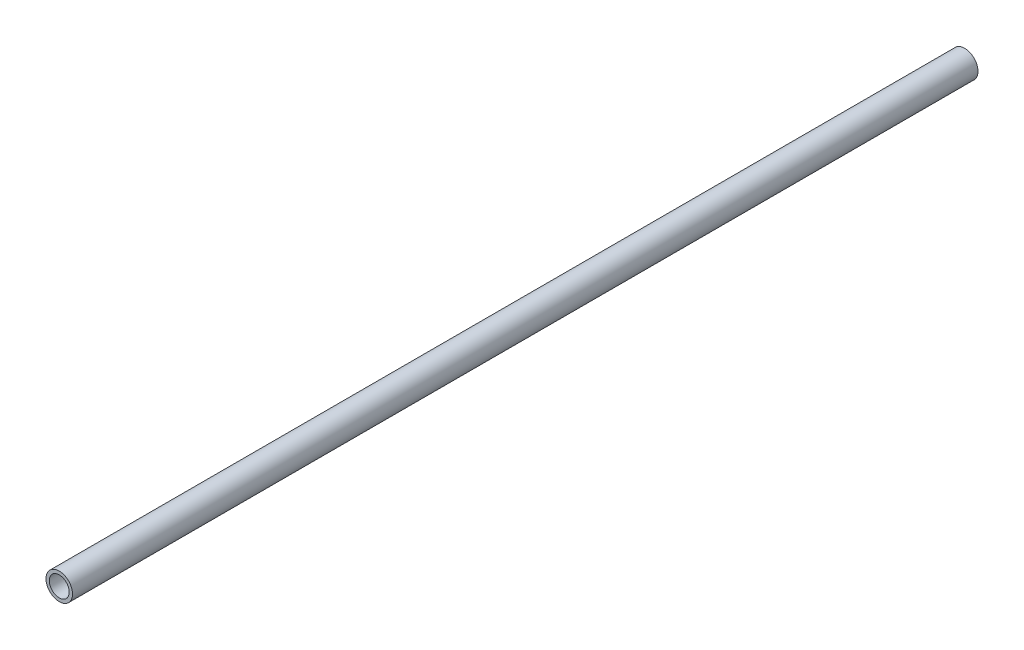
ISO-10303-21;
HEADER;
FILE_DESCRIPTION(('STEP AP214'),'2;1');
FILE_NAME('part.step','',(''),(''),'','','');
FILE_SCHEMA(('AUTOMOTIVE_DESIGN { 1 0 10303 214 1 1 1 1 }'));
ENDSEC;
DATA;
#1=APPLICATION_CONTEXT('core data for automotive mechanical design processes');
#2=APPLICATION_PROTOCOL_DEFINITION('international standard','automotive_design',2000,#1);
#3=PRODUCT_CONTEXT('',#1,'mechanical');
#4=PRODUCT('Part','Part','',(#3));
#5=PRODUCT_RELATED_PRODUCT_CATEGORY('part','',(#4));
#6=PRODUCT_DEFINITION_FORMATION('','',#4);
#7=PRODUCT_DEFINITION_CONTEXT('part definition',#1,'design');
#8=PRODUCT_DEFINITION('design','',#6,#7);
#9=PRODUCT_DEFINITION_SHAPE('','',#8);
#10=(LENGTH_UNIT() NAMED_UNIT(*) SI_UNIT(.MILLI.,.METRE.));
#11=(NAMED_UNIT(*) PLANE_ANGLE_UNIT() SI_UNIT($,.RADIAN.));
#12=(NAMED_UNIT(*) SI_UNIT($,.STERADIAN.) SOLID_ANGLE_UNIT());
#13=UNCERTAINTY_MEASURE_WITH_UNIT(LENGTH_MEASURE(1.E-05),#10,'distance_accuracy_value','');
#14=(GEOMETRIC_REPRESENTATION_CONTEXT(3) GLOBAL_UNCERTAINTY_ASSIGNED_CONTEXT((#13)) GLOBAL_UNIT_ASSIGNED_CONTEXT((#10,
#11,#12)) REPRESENTATION_CONTEXT('',''));
#15=CARTESIAN_POINT('',(0.,0.,0.));
#16=DIRECTION('',(0.,0.,1.));
#17=DIRECTION('',(1.,0.,0.));
#18=AXIS2_PLACEMENT_3D('',#15,#16,#17);
#19=CARTESIAN_POINT('',(0.,0.,136.398));
#20=DIRECTION('',(0.,0.,1.));
#21=DIRECTION('',(1.,0.,0.));
#22=AXIS2_PLACEMENT_3D('',#19,#20,#21);
#23=PLANE('',#22);
#24=CARTESIAN_POINT('',(0.,0.,136.398));
#25=DIRECTION('',(0.,0.,1.));
#26=DIRECTION('',(1.,0.,0.));
#27=AXIS2_PLACEMENT_3D('',#24,#25,#26);
#28=CIRCLE('',#27,2.);
#29=CARTESIAN_POINT('',(2.,0.,136.398));
#30=VERTEX_POINT('',#29);
#31=EDGE_CURVE('E10',#30,#30,#28,.T.);
#32=ORIENTED_EDGE('',*,*,#31,.T.);
#33=EDGE_LOOP('',(#32));
#34=FACE_BOUND('',#33,.T.);
#35=CARTESIAN_POINT('',(0.,0.,136.398));
#36=DIRECTION('',(0.,0.,1.));
#37=DIRECTION('',(1.,0.,0.));
#38=AXIS2_PLACEMENT_3D('',#35,#36,#37);
#39=CIRCLE('',#38,1.5);
#40=CARTESIAN_POINT('',(1.5,0.,136.398));
#41=VERTEX_POINT('',#40);
#42=EDGE_CURVE('E50',#41,#41,#39,.T.);
#43=ORIENTED_EDGE('',*,*,#42,.F.);
#44=EDGE_LOOP('',(#43));
#45=FACE_BOUND('',#44,.T.);
#46=ADVANCED_FACE('F37',(#34,#45),#23,.T.);
#47=CARTESIAN_POINT('',(0.,0.,0.));
#48=DIRECTION('',(0.,0.,1.));
#49=DIRECTION('',(1.,0.,0.));
#50=AXIS2_PLACEMENT_3D('',#47,#48,#49);
#51=PLANE('',#50);
#52=CARTESIAN_POINT('',(0.,0.,0.));
#53=DIRECTION('',(0.,0.,1.));
#54=DIRECTION('',(1.,0.,0.));
#55=AXIS2_PLACEMENT_3D('',#52,#53,#54);
#56=CIRCLE('',#55,2.);
#57=CARTESIAN_POINT('',(2.,0.,0.));
#58=VERTEX_POINT('',#57);
#59=EDGE_CURVE('E41',#58,#58,#56,.T.);
#60=ORIENTED_EDGE('',*,*,#59,.F.);
#61=EDGE_LOOP('',(#60));
#62=FACE_BOUND('',#61,.T.);
#63=CARTESIAN_POINT('',(0.,0.,0.));
#64=DIRECTION('',(0.,0.,1.));
#65=DIRECTION('',(1.,0.,0.));
#66=AXIS2_PLACEMENT_3D('',#63,#64,#65);
#67=CIRCLE('',#66,1.5);
#68=CARTESIAN_POINT('',(1.5,0.,0.));
#69=VERTEX_POINT('',#68);
#70=EDGE_CURVE('E52',#69,#69,#67,.T.);
#71=ORIENTED_EDGE('',*,*,#70,.T.);
#72=EDGE_LOOP('',(#71));
#73=FACE_BOUND('',#72,.T.);
#74=ADVANCED_FACE('F64',(#62,#73),#51,.F.);
#75=CARTESIAN_POINT('',(0.,0.,136.398));
#76=DIRECTION('',(0.,0.,-1.));
#77=DIRECTION('',(-1.,0.,0.));
#78=AXIS2_PLACEMENT_3D('',#75,#76,#77);
#79=CYLINDRICAL_SURFACE('',#78,2.);
#80=ORIENTED_EDGE('',*,*,#31,.F.);
#81=EDGE_LOOP('',(#80));
#82=FACE_BOUND('',#81,.T.);
#83=ORIENTED_EDGE('',*,*,#59,.T.);
#84=EDGE_LOOP('',(#83));
#85=FACE_BOUND('',#84,.T.);
#86=ADVANCED_FACE('F39',(#82,#85),#79,.T.);
#87=CARTESIAN_POINT('',(0.,0.,136.398));
#88=DIRECTION('',(0.,0.,-1.));
#89=DIRECTION('',(-1.,0.,0.));
#90=AXIS2_PLACEMENT_3D('',#87,#88,#89);
#91=CYLINDRICAL_SURFACE('',#90,1.5);
#92=ORIENTED_EDGE('',*,*,#42,.T.);
#93=EDGE_LOOP('',(#92));
#94=FACE_BOUND('',#93,.T.);
#95=ORIENTED_EDGE('',*,*,#70,.F.);
#96=EDGE_LOOP('',(#95));
#97=FACE_BOUND('',#96,.T.);
#98=ADVANCED_FACE('F60',(#94,#97),#91,.F.);
#99=CLOSED_SHELL('',(#46,#74,#86,#98));
#100=MANIFOLD_SOLID_BREP('B2',#99);
#101=ADVANCED_BREP_SHAPE_REPRESENTATION('',(#18,#100),#14);
#102=SHAPE_DEFINITION_REPRESENTATION(#9,#101);
ENDSEC;
END-ISO-10303-21;
